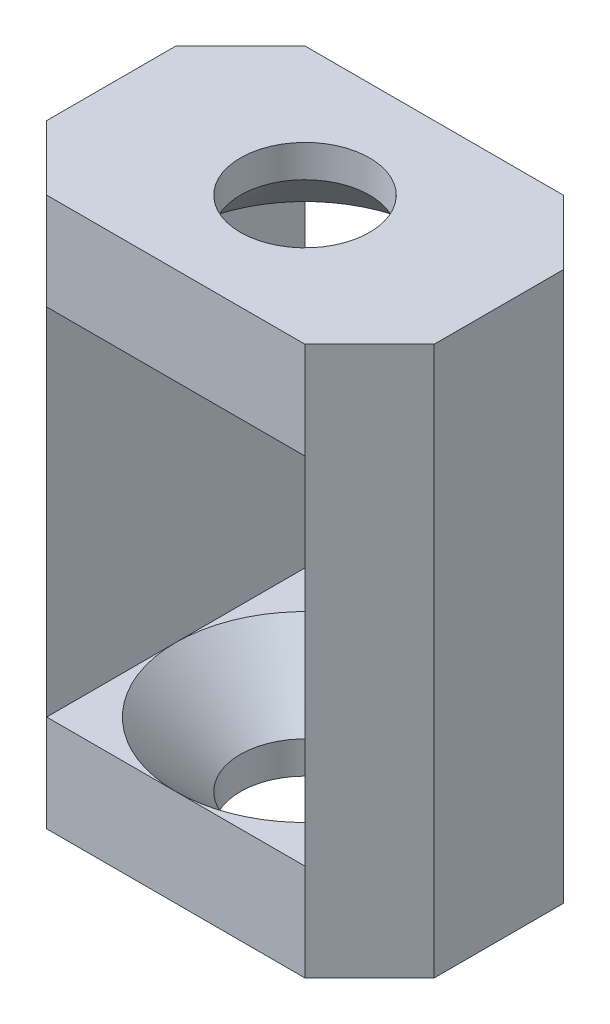
ISO-10303-21;
HEADER;
FILE_DESCRIPTION(('STEP AP214'),'2;1');
FILE_NAME('part.step','',(''),(''),'','','');
FILE_SCHEMA(('AUTOMOTIVE_DESIGN { 1 0 10303 214 1 1 1 1 }'));
ENDSEC;
DATA;
#1=APPLICATION_CONTEXT('core data for automotive mechanical design processes');
#2=APPLICATION_PROTOCOL_DEFINITION('international standard','automotive_design',2000,#1);
#3=PRODUCT_CONTEXT('',#1,'mechanical');
#4=PRODUCT('Part','Part','',(#3));
#5=PRODUCT_RELATED_PRODUCT_CATEGORY('part','',(#4));
#6=PRODUCT_DEFINITION_FORMATION('','',#4);
#7=PRODUCT_DEFINITION_CONTEXT('part definition',#1,'design');
#8=PRODUCT_DEFINITION('design','',#6,#7);
#9=PRODUCT_DEFINITION_SHAPE('','',#8);
#10=(LENGTH_UNIT() NAMED_UNIT(*) SI_UNIT(.MILLI.,.METRE.));
#11=(NAMED_UNIT(*) PLANE_ANGLE_UNIT() SI_UNIT($,.RADIAN.));
#12=(NAMED_UNIT(*) SI_UNIT($,.STERADIAN.) SOLID_ANGLE_UNIT());
#13=UNCERTAINTY_MEASURE_WITH_UNIT(LENGTH_MEASURE(1.E-05),#10,'distance_accuracy_value','');
#14=(GEOMETRIC_REPRESENTATION_CONTEXT(3) GLOBAL_UNCERTAINTY_ASSIGNED_CONTEXT((#13)) GLOBAL_UNIT_ASSIGNED_CONTEXT((#10,
#11,#12)) REPRESENTATION_CONTEXT('',''));
#15=CARTESIAN_POINT('',(0.,0.,0.));
#16=DIRECTION('',(0.,0.,1.));
#17=DIRECTION('',(1.,0.,0.));
#18=AXIS2_PLACEMENT_3D('',#15,#16,#17);
#19=CARTESIAN_POINT('',(-4.00000000000001,3.,-80.5));
#20=DIRECTION('',(0.,-1.,0.));
#21=DIRECTION('',(1.,0.,0.));
#22=AXIS2_PLACEMENT_3D('',#19,#20,#21);
#23=PLANE('',#22);
#24=DIRECTION('',(0.,0.,1.));
#25=VECTOR('',#24,1.);
#26=CARTESIAN_POINT('',(4.,3.,-80.5));
#27=LINE('',#26,#25);
#28=CARTESIAN_POINT('',(4.,3.,0.));
#29=VERTEX_POINT('',#28);
#30=CARTESIAN_POINT('',(3.99999999999999,3.,4.));
#31=VERTEX_POINT('',#30);
#32=EDGE_CURVE('E192',#29,#31,#27,.T.);
#33=ORIENTED_EDGE('',*,*,#32,.F.);
#34=CARTESIAN_POINT('',(0.,3.,0.));
#35=DIRECTION('',(0.,-1.,0.));
#36=DIRECTION('',(1.,0.,0.));
#37=AXIS2_PLACEMENT_3D('',#34,#35,#36);
#38=CIRCLE('',#37,3.99999999999999);
#39=CARTESIAN_POINT('',(0.,3.,4.));
#40=VERTEX_POINT('',#39);
#41=EDGE_CURVE('E60',#29,#40,#38,.T.);
#42=ORIENTED_EDGE('',*,*,#41,.T.);
#43=DIRECTION('',(-1.,0.,0.));
#44=VECTOR('',#43,1.);
#45=CARTESIAN_POINT('',(-6.00000000000001,3.,4.));
#46=LINE('',#45,#44);
#47=EDGE_CURVE('E252',#31,#40,#46,.T.);
#48=ORIENTED_EDGE('',*,*,#47,.F.);
#49=EDGE_LOOP('',(#33,#42,#48));
#50=FACE_BOUND('',#49,.T.);
#51=ADVANCED_FACE('F50',(#50),#23,.F.);
#52=CARTESIAN_POINT('',(-4.00000000000001,3.,3.99999999999998));
#53=VERTEX_POINT('',#52);
#54=EDGE_CURVE('E253',#40,#53,#46,.T.);
#55=ORIENTED_EDGE('',*,*,#54,.F.);
#56=CARTESIAN_POINT('',(0.,3.,0.));
#57=DIRECTION('',(0.,-1.,0.));
#58=DIRECTION('',(1.,0.,0.));
#59=AXIS2_PLACEMENT_3D('',#56,#57,#58);
#60=CIRCLE('',#59,3.99999999999999);
#61=CARTESIAN_POINT('',(-4.,3.,0.));
#62=VERTEX_POINT('',#61);
#63=EDGE_CURVE('E376',#40,#62,#60,.T.);
#64=ORIENTED_EDGE('',*,*,#63,.T.);
#65=DIRECTION('',(0.,0.,1.));
#66=VECTOR('',#65,1.);
#67=CARTESIAN_POINT('',(-4.00000000000001,3.,-80.5));
#68=LINE('',#67,#66);
#69=EDGE_CURVE('E373',#62,#53,#68,.T.);
#70=ORIENTED_EDGE('',*,*,#69,.T.);
#71=EDGE_LOOP('',(#55,#64,#70));
#72=FACE_BOUND('',#71,.T.);
#73=ADVANCED_FACE('F342',(#72),#23,.F.);
#74=CARTESIAN_POINT('',(-4.00000000000001,3.,-4.00000000000002));
#75=VERTEX_POINT('',#74);
#76=EDGE_CURVE('E370',#75,#62,#68,.T.);
#77=ORIENTED_EDGE('',*,*,#76,.T.);
#78=CARTESIAN_POINT('',(0.,3.,0.));
#79=DIRECTION('',(0.,-1.,0.));
#80=DIRECTION('',(1.,0.,0.));
#81=AXIS2_PLACEMENT_3D('',#78,#79,#80);
#82=CIRCLE('',#81,3.99999999999999);
#83=CARTESIAN_POINT('',(0.,3.,-4.));
#84=VERTEX_POINT('',#83);
#85=EDGE_CURVE('E63',#62,#84,#82,.T.);
#86=ORIENTED_EDGE('',*,*,#85,.T.);
#87=DIRECTION('',(1.,0.,0.));
#88=VECTOR('',#87,1.);
#89=CARTESIAN_POINT('',(-6.00000000000001,3.,-4.));
#90=LINE('',#89,#88);
#91=EDGE_CURVE('E171',#75,#84,#90,.T.);
#92=ORIENTED_EDGE('',*,*,#91,.F.);
#93=EDGE_LOOP('',(#77,#86,#92));
#94=FACE_BOUND('',#93,.T.);
#95=ADVANCED_FACE('F348',(#94),#23,.F.);
#96=CARTESIAN_POINT('',(-4.00000000000001,14.,-80.5));
#97=DIRECTION('',(0.,1.,0.));
#98=DIRECTION('',(0.,0.,1.));
#99=AXIS2_PLACEMENT_3D('',#96,#97,#98);
#100=PLANE('',#99);
#101=DIRECTION('',(1.,0.,0.));
#102=VECTOR('',#101,1.);
#103=CARTESIAN_POINT('',(-6.00000000000001,14.,4.));
#104=LINE('',#103,#102);
#105=CARTESIAN_POINT('',(0.,14.,4.));
#106=VERTEX_POINT('',#105);
#107=CARTESIAN_POINT('',(4.00000000000001,14.,3.99999999999996));
#108=VERTEX_POINT('',#107);
#109=EDGE_CURVE('E246',#106,#108,#104,.T.);
#110=ORIENTED_EDGE('',*,*,#109,.F.);
#111=CARTESIAN_POINT('',(0.,14.,0.));
#112=DIRECTION('',(0.,1.,0.));
#113=DIRECTION('',(0.,0.,1.));
#114=AXIS2_PLACEMENT_3D('',#111,#112,#113);
#115=CIRCLE('',#114,4.00000000000001);
#116=CARTESIAN_POINT('',(4.00000000000001,14.,0.));
#117=VERTEX_POINT('',#116);
#118=EDGE_CURVE('E461',#106,#117,#115,.T.);
#119=ORIENTED_EDGE('',*,*,#118,.T.);
#120=DIRECTION('',(0.,0.,1.));
#121=VECTOR('',#120,1.);
#122=CARTESIAN_POINT('',(4.00000000000001,14.,-80.5));
#123=LINE('',#122,#121);
#124=EDGE_CURVE('E476',#117,#108,#123,.T.);
#125=ORIENTED_EDGE('',*,*,#124,.T.);
#126=EDGE_LOOP('',(#110,#119,#125));
#127=FACE_BOUND('',#126,.T.);
#128=ADVANCED_FACE('F357',(#127),#100,.F.);
#129=CARTESIAN_POINT('',(4.,14.,-4.));
#130=VERTEX_POINT('',#129);
#131=EDGE_CURVE('E184',#130,#117,#123,.T.);
#132=ORIENTED_EDGE('',*,*,#131,.T.);
#133=CARTESIAN_POINT('',(0.,14.,0.));
#134=DIRECTION('',(0.,1.,0.));
#135=DIRECTION('',(0.,0.,1.));
#136=AXIS2_PLACEMENT_3D('',#133,#134,#135);
#137=CIRCLE('',#136,4.00000000000001);
#138=CARTESIAN_POINT('',(0.,14.,-4.));
#139=VERTEX_POINT('',#138);
#140=EDGE_CURVE('E462',#117,#139,#137,.T.);
#141=ORIENTED_EDGE('',*,*,#140,.T.);
#142=DIRECTION('',(-1.,0.,0.));
#143=VECTOR('',#142,1.);
#144=CARTESIAN_POINT('',(-6.00000000000001,14.,-4.));
#145=LINE('',#144,#143);
#146=EDGE_CURVE('E172',#130,#139,#145,.T.);
#147=ORIENTED_EDGE('',*,*,#146,.F.);
#148=EDGE_LOOP('',(#132,#141,#147));
#149=FACE_BOUND('',#148,.T.);
#150=ADVANCED_FACE('F365',(#149),#100,.F.);
#151=CARTESIAN_POINT('',(-4.00000000000001,14.,-4.00000000000002));
#152=VERTEX_POINT('',#151);
#153=EDGE_CURVE('E495',#139,#152,#145,.T.);
#154=ORIENTED_EDGE('',*,*,#153,.F.);
#155=CARTESIAN_POINT('',(0.,14.,0.));
#156=DIRECTION('',(0.,1.,0.));
#157=DIRECTION('',(0.,0.,1.));
#158=AXIS2_PLACEMENT_3D('',#155,#156,#157);
#159=CIRCLE('',#158,4.00000000000001);
#160=CARTESIAN_POINT('',(-4.00000000000001,14.,0.));
#161=VERTEX_POINT('',#160);
#162=EDGE_CURVE('E467',#139,#161,#159,.T.);
#163=ORIENTED_EDGE('',*,*,#162,.T.);
#164=DIRECTION('',(0.,0.,1.));
#165=VECTOR('',#164,1.);
#166=CARTESIAN_POINT('',(-4.00000000000001,14.,-80.5));
#167=LINE('',#166,#165);
#168=EDGE_CURVE('E483',#152,#161,#167,.T.);
#169=ORIENTED_EDGE('',*,*,#168,.F.);
#170=EDGE_LOOP('',(#154,#163,#169));
#171=FACE_BOUND('',#170,.T.);
#172=ADVANCED_FACE('F280',(#171),#100,.F.);
#173=CARTESIAN_POINT('',(0.,17.,0.));
#174=DIRECTION('',(0.,-1.,0.));
#175=DIRECTION('',(0.,0.,-1.));
#176=AXIS2_PLACEMENT_3D('',#173,#174,#175);
#177=PLANE('',#176);
#178=DIRECTION('',(-1.,0.,0.));
#179=VECTOR('',#178,1.);
#180=CARTESIAN_POINT('',(-6.00000000000001,17.,-4.));
#181=LINE('',#180,#179);
#182=CARTESIAN_POINT('',(4.,17.,-4.));
#183=VERTEX_POINT('',#182);
#184=CARTESIAN_POINT('',(-4.,17.,-4.));
#185=VERTEX_POINT('',#184);
#186=EDGE_CURVE('E499',#183,#185,#181,.T.);
#187=ORIENTED_EDGE('',*,*,#186,.T.);
#188=DIRECTION('',(0.707106781186548,0.,-0.707106781186547));
#189=VECTOR('',#188,1.);
#190=CARTESIAN_POINT('',(-6.00000000000001,17.,-1.99999999999999));
#191=LINE('',#190,#189);
#192=CARTESIAN_POINT('',(-6.00000000000001,17.,-1.99999999999999));
#193=VERTEX_POINT('',#192);
#194=EDGE_CURVE('E221',#185,#193,#191,.F.);
#195=ORIENTED_EDGE('',*,*,#194,.T.);
#196=DIRECTION('',(0.,0.,1.));
#197=VECTOR('',#196,1.);
#198=CARTESIAN_POINT('',(-6.00000000000001,17.,4.));
#199=LINE('',#198,#197);
#200=CARTESIAN_POINT('',(-6.00000000000001,17.,1.99999999999999));
#201=VERTEX_POINT('',#200);
#202=EDGE_CURVE('E416',#193,#201,#199,.T.);
#203=ORIENTED_EDGE('',*,*,#202,.T.);
#204=DIRECTION('',(-0.707106781186547,0.,-0.707106781186548));
#205=VECTOR('',#204,1.);
#206=CARTESIAN_POINT('',(-4.00000000000001,17.,4.));
#207=LINE('',#206,#205);
#208=CARTESIAN_POINT('',(-4.00000000000001,17.,4.));
#209=VERTEX_POINT('',#208);
#210=EDGE_CURVE('E222',#201,#209,#207,.F.);
#211=ORIENTED_EDGE('',*,*,#210,.T.);
#212=DIRECTION('',(1.,0.,0.));
#213=VECTOR('',#212,1.);
#214=CARTESIAN_POINT('',(-6.00000000000001,17.,4.));
#215=LINE('',#214,#213);
#216=CARTESIAN_POINT('',(3.99999999999999,17.,4.));
#217=VERTEX_POINT('',#216);
#218=EDGE_CURVE('E410',#209,#217,#215,.T.);
#219=ORIENTED_EDGE('',*,*,#218,.T.);
#220=DIRECTION('',(-0.707106781186549,0.,0.707106781186546));
#221=VECTOR('',#220,1.);
#222=CARTESIAN_POINT('',(5.99999999999999,17.,2.00000000000001));
#223=LINE('',#222,#221);
#224=CARTESIAN_POINT('',(5.99999999999999,17.,2.00000000000001));
#225=VERTEX_POINT('',#224);
#226=EDGE_CURVE('E214',#217,#225,#223,.F.);
#227=ORIENTED_EDGE('',*,*,#226,.T.);
#228=DIRECTION('',(0.,0.,-1.));
#229=VECTOR('',#228,1.);
#230=CARTESIAN_POINT('',(5.99999999999999,17.,4.));
#231=LINE('',#230,#229);
#232=CARTESIAN_POINT('',(5.99999999999999,17.,-2.));
#233=VERTEX_POINT('',#232);
#234=EDGE_CURVE('E421',#225,#233,#231,.T.);
#235=ORIENTED_EDGE('',*,*,#234,.T.);
#236=DIRECTION('',(0.707106781186547,0.,0.707106781186548));
#237=VECTOR('',#236,1.);
#238=CARTESIAN_POINT('',(4.,17.,-4.));
#239=LINE('',#238,#237);
#240=EDGE_CURVE('E217',#233,#183,#239,.F.);
#241=ORIENTED_EDGE('',*,*,#240,.T.);
#242=EDGE_LOOP('',(#187,#195,#203,#211,#219,#227,#235,#241));
#243=FACE_BOUND('',#242,.T.);
#244=CARTESIAN_POINT('',(0.,17.000012,0.));
#245=DIRECTION('',(0.,1.,0.));
#246=DIRECTION('',(0.,0.,1.));
#247=AXIS2_PLACEMENT_3D('',#244,#245,#246);
#248=CIRCLE('',#247,2.);
#249=CARTESIAN_POINT('',(0.,17.000012,2.));
#250=VERTEX_POINT('',#249);
#251=EDGE_CURVE('E261',#250,#250,#248,.T.);
#252=ORIENTED_EDGE('',*,*,#251,.F.);
#253=EDGE_LOOP('',(#252));
#254=FACE_BOUND('',#253,.T.);
#255=ADVANCED_FACE('F270',(#243,#254),#177,.F.);
#256=CARTESIAN_POINT('',(-6.00000000000001,17.,-4.));
#257=DIRECTION('',(0.,0.,1.));
#258=DIRECTION('',(1.,0.,0.));
#259=AXIS2_PLACEMENT_3D('',#256,#257,#258);
#260=PLANE('',#259);
#261=DIRECTION('',(0.,1.,0.));
#262=VECTOR('',#261,1.);
#263=CARTESIAN_POINT('',(-4.,17.,-4.));
#264=LINE('',#263,#262);
#265=CARTESIAN_POINT('',(-4.,0.,-4.));
#266=VERTEX_POINT('',#265);
#267=EDGE_CURVE('E215',#266,#75,#264,.T.);
#268=ORIENTED_EDGE('',*,*,#267,.T.);
#269=ORIENTED_EDGE('',*,*,#91,.T.);
#270=CARTESIAN_POINT('',(4.,3.,-4.00000000000002));
#271=VERTEX_POINT('',#270);
#272=EDGE_CURVE('E162',#84,#271,#90,.T.);
#273=ORIENTED_EDGE('',*,*,#272,.T.);
#274=DIRECTION('',(0.,-1.,0.));
#275=VECTOR('',#274,1.);
#276=CARTESIAN_POINT('',(4.,17.,-4.));
#277=LINE('',#276,#275);
#278=CARTESIAN_POINT('',(4.,0.,-4.));
#279=VERTEX_POINT('',#278);
#280=EDGE_CURVE('E166',#271,#279,#277,.T.);
#281=ORIENTED_EDGE('',*,*,#280,.T.);
#282=DIRECTION('',(-1.,0.,0.));
#283=VECTOR('',#282,1.);
#284=CARTESIAN_POINT('',(-6.00000000000001,0.,-4.));
#285=LINE('',#284,#283);
#286=EDGE_CURVE('E430',#279,#266,#285,.T.);
#287=ORIENTED_EDGE('',*,*,#286,.T.);
#288=EDGE_LOOP('',(#268,#269,#273,#281,#287));
#289=FACE_BOUND('',#288,.T.);
#290=ADVANCED_FACE('F167',(#289),#260,.F.);
#291=CARTESIAN_POINT('',(-6.00000000000001,17.,4.));
#292=DIRECTION('',(0.,0.,-1.));
#293=DIRECTION('',(-1.,0.,0.));
#294=AXIS2_PLACEMENT_3D('',#291,#292,#293);
#295=PLANE('',#294);
#296=DIRECTION('',(0.,1.,0.));
#297=VECTOR('',#296,1.);
#298=CARTESIAN_POINT('',(3.99999999999999,17.,4.));
#299=LINE('',#298,#297);
#300=CARTESIAN_POINT('',(3.99999999999999,0.,4.));
#301=VERTEX_POINT('',#300);
#302=EDGE_CURVE('E227',#301,#31,#299,.T.);
#303=ORIENTED_EDGE('',*,*,#302,.T.);
#304=ORIENTED_EDGE('',*,*,#47,.T.);
#305=ORIENTED_EDGE('',*,*,#54,.T.);
#306=DIRECTION('',(0.,-1.,0.));
#307=VECTOR('',#306,1.);
#308=CARTESIAN_POINT('',(-4.00000000000001,17.,4.));
#309=LINE('',#308,#307);
#310=CARTESIAN_POINT('',(-4.00000000000001,0.,4.));
#311=VERTEX_POINT('',#310);
#312=EDGE_CURVE('E235',#53,#311,#309,.T.);
#313=ORIENTED_EDGE('',*,*,#312,.T.);
#314=DIRECTION('',(1.,0.,0.));
#315=VECTOR('',#314,1.);
#316=CARTESIAN_POINT('',(-6.00000000000001,0.,4.));
#317=LINE('',#316,#315);
#318=EDGE_CURVE('E400',#311,#301,#317,.T.);
#319=ORIENTED_EDGE('',*,*,#318,.T.);
#320=EDGE_LOOP('',(#303,#304,#305,#313,#319));
#321=FACE_BOUND('',#320,.T.);
#322=ADVANCED_FACE('F289',(#321),#295,.F.);
#323=CARTESIAN_POINT('',(5.99999999999999,17.,4.));
#324=DIRECTION('',(-1.,0.,0.));
#325=DIRECTION('',(0.,0.,1.));
#326=AXIS2_PLACEMENT_3D('',#323,#324,#325);
#327=PLANE('',#326);
#328=DIRECTION('',(0.,0.,-1.));
#329=VECTOR('',#328,1.);
#330=CARTESIAN_POINT('',(5.99999999999999,0.,4.));
#331=LINE('',#330,#329);
#332=CARTESIAN_POINT('',(5.99999999999999,0.,2.00000000000001));
#333=VERTEX_POINT('',#332);
#334=CARTESIAN_POINT('',(5.99999999999999,0.,-2.));
#335=VERTEX_POINT('',#334);
#336=EDGE_CURVE('E425',#333,#335,#331,.T.);
#337=ORIENTED_EDGE('',*,*,#336,.T.);
#338=DIRECTION('',(0.,1.,0.));
#339=VECTOR('',#338,1.);
#340=CARTESIAN_POINT('',(5.99999999999999,17.,-2.));
#341=LINE('',#340,#339);
#342=EDGE_CURVE('E242',#335,#233,#341,.T.);
#343=ORIENTED_EDGE('',*,*,#342,.T.);
#344=ORIENTED_EDGE('',*,*,#234,.F.);
#345=DIRECTION('',(0.,-1.,0.));
#346=VECTOR('',#345,1.);
#347=CARTESIAN_POINT('',(5.99999999999999,17.,2.00000000000001));
#348=LINE('',#347,#346);
#349=EDGE_CURVE('E236',#225,#333,#348,.T.);
#350=ORIENTED_EDGE('',*,*,#349,.T.);
#351=EDGE_LOOP('',(#337,#343,#344,#350));
#352=FACE_BOUND('',#351,.T.);
#353=ADVANCED_FACE('F300',(#352),#327,.F.);
#354=EDGE_CURVE('E205',#183,#130,#277,.T.);
#355=ORIENTED_EDGE('',*,*,#354,.T.);
#356=ORIENTED_EDGE('',*,*,#146,.T.);
#357=ORIENTED_EDGE('',*,*,#153,.T.);
#358=EDGE_CURVE('E210',#152,#185,#264,.T.);
#359=ORIENTED_EDGE('',*,*,#358,.T.);
#360=ORIENTED_EDGE('',*,*,#186,.F.);
#361=EDGE_LOOP('',(#355,#356,#357,#359,#360));
#362=FACE_BOUND('',#361,.T.);
#363=ADVANCED_FACE('F291',(#362),#260,.F.);
#364=CARTESIAN_POINT('',(-6.00000000000001,17.,4.));
#365=DIRECTION('',(1.,0.,0.));
#366=DIRECTION('',(0.,0.,-1.));
#367=AXIS2_PLACEMENT_3D('',#364,#365,#366);
#368=PLANE('',#367);
#369=ORIENTED_EDGE('',*,*,#202,.F.);
#370=DIRECTION('',(0.,-1.,0.));
#371=VECTOR('',#370,1.);
#372=CARTESIAN_POINT('',(-6.00000000000001,17.,-1.99999999999999));
#373=LINE('',#372,#371);
#374=CARTESIAN_POINT('',(-6.00000000000001,0.,-1.99999999999999));
#375=VERTEX_POINT('',#374);
#376=EDGE_CURVE('E445',#193,#375,#373,.T.);
#377=ORIENTED_EDGE('',*,*,#376,.T.);
#378=DIRECTION('',(0.,0.,1.));
#379=VECTOR('',#378,1.);
#380=CARTESIAN_POINT('',(-6.00000000000001,0.,4.));
#381=LINE('',#380,#379);
#382=CARTESIAN_POINT('',(-6.00000000000001,0.,1.99999999999999));
#383=VERTEX_POINT('',#382);
#384=EDGE_CURVE('E431',#375,#383,#381,.T.);
#385=ORIENTED_EDGE('',*,*,#384,.T.);
#386=DIRECTION('',(0.,1.,0.));
#387=VECTOR('',#386,1.);
#388=CARTESIAN_POINT('',(-6.00000000000001,17.,1.99999999999999));
#389=LINE('',#388,#387);
#390=EDGE_CURVE('E417',#383,#201,#389,.T.);
#391=ORIENTED_EDGE('',*,*,#390,.T.);
#392=EDGE_LOOP('',(#369,#377,#385,#391));
#393=FACE_BOUND('',#392,.T.);
#394=ADVANCED_FACE('F288',(#393),#368,.F.);
#395=CARTESIAN_POINT('',(-4.00000000000001,14.,3.99999999999998));
#396=VERTEX_POINT('',#395);
#397=EDGE_CURVE('E232',#209,#396,#309,.T.);
#398=ORIENTED_EDGE('',*,*,#397,.T.);
#399=EDGE_CURVE('E250',#396,#106,#104,.T.);
#400=ORIENTED_EDGE('',*,*,#399,.T.);
#401=ORIENTED_EDGE('',*,*,#109,.T.);
#402=EDGE_CURVE('E230',#108,#217,#299,.T.);
#403=ORIENTED_EDGE('',*,*,#402,.T.);
#404=ORIENTED_EDGE('',*,*,#218,.F.);
#405=EDGE_LOOP('',(#398,#400,#401,#403,#404));
#406=FACE_BOUND('',#405,.T.);
#407=ADVANCED_FACE('F283',(#406),#295,.F.);
#408=CARTESIAN_POINT('',(0.,0.,0.));
#409=DIRECTION('',(0.,-1.,0.));
#410=DIRECTION('',(0.,0.,-1.));
#411=AXIS2_PLACEMENT_3D('',#408,#409,#410);
#412=PLANE('',#411);
#413=CARTESIAN_POINT('',(0.,0.,0.));
#414=DIRECTION('',(0.,1.,0.));
#415=DIRECTION('',(0.,0.,1.));
#416=AXIS2_PLACEMENT_3D('',#413,#414,#415);
#417=CIRCLE('',#416,2.);
#418=CARTESIAN_POINT('',(0.,0.,2.));
#419=VERTEX_POINT('',#418);
#420=EDGE_CURVE('E674',#419,#419,#417,.T.);
#421=ORIENTED_EDGE('',*,*,#420,.T.);
#422=EDGE_LOOP('',(#421));
#423=FACE_BOUND('',#422,.T.);
#424=ORIENTED_EDGE('',*,*,#384,.F.);
#425=DIRECTION('',(-0.707106781186548,0.,0.707106781186547));
#426=VECTOR('',#425,1.);
#427=CARTESIAN_POINT('',(-4.,0.,-4.));
#428=LINE('',#427,#426);
#429=EDGE_CURVE('E201',#375,#266,#428,.F.);
#430=ORIENTED_EDGE('',*,*,#429,.T.);
#431=ORIENTED_EDGE('',*,*,#286,.F.);
#432=DIRECTION('',(-0.707106781186547,0.,-0.707106781186548));
#433=VECTOR('',#432,1.);
#434=CARTESIAN_POINT('',(4.,0.,-4.));
#435=LINE('',#434,#433);
#436=EDGE_CURVE('E200',#279,#335,#435,.F.);
#437=ORIENTED_EDGE('',*,*,#436,.T.);
#438=ORIENTED_EDGE('',*,*,#336,.F.);
#439=DIRECTION('',(0.707106781186549,0.,-0.707106781186546));
#440=VECTOR('',#439,1.);
#441=CARTESIAN_POINT('',(3.99999999999999,0.,4.));
#442=LINE('',#441,#440);
#443=EDGE_CURVE('E399',#333,#301,#442,.F.);
#444=ORIENTED_EDGE('',*,*,#443,.T.);
#445=ORIENTED_EDGE('',*,*,#318,.F.);
#446=DIRECTION('',(0.707106781186547,0.,0.707106781186548));
#447=VECTOR('',#446,1.);
#448=CARTESIAN_POINT('',(-4.00000000000001,0.,4.));
#449=LINE('',#448,#447);
#450=EDGE_CURVE('E208',#311,#383,#449,.F.);
#451=ORIENTED_EDGE('',*,*,#450,.T.);
#452=EDGE_LOOP('',(#424,#430,#431,#437,#438,#444,#445,#451));
#453=FACE_BOUND('',#452,.T.);
#454=ADVANCED_FACE('F278',(#423,#453),#412,.T.);
#455=CARTESIAN_POINT('',(-6.00000000000001,17.,-1.99999999999999));
#456=DIRECTION('',(0.707106781186547,0.,0.707106781186548));
#457=DIRECTION('',(0.,-1.,0.));
#458=AXIS2_PLACEMENT_3D('',#455,#456,#457);
#459=PLANE('',#458);
#460=ORIENTED_EDGE('',*,*,#194,.F.);
#461=ORIENTED_EDGE('',*,*,#358,.F.);
#462=DIRECTION('',(0.,-1.,0.));
#463=VECTOR('',#462,1.);
#464=CARTESIAN_POINT('',(-4.00000000000001,17.,-3.99999999999999));
#465=LINE('',#464,#463);
#466=EDGE_CURVE('E189',#75,#152,#465,.F.);
#467=ORIENTED_EDGE('',*,*,#466,.F.);
#468=ORIENTED_EDGE('',*,*,#267,.F.);
#469=ORIENTED_EDGE('',*,*,#429,.F.);
#470=ORIENTED_EDGE('',*,*,#376,.F.);
#471=EDGE_LOOP('',(#460,#461,#467,#468,#469,#470));
#472=FACE_BOUND('',#471,.T.);
#473=ADVANCED_FACE('F282',(#472),#459,.F.);
#474=CARTESIAN_POINT('',(-4.00000000000001,17.,4.));
#475=DIRECTION('',(0.707106781186548,0.,-0.707106781186547));
#476=DIRECTION('',(0.,-1.,0.));
#477=AXIS2_PLACEMENT_3D('',#474,#475,#476);
#478=PLANE('',#477);
#479=ORIENTED_EDGE('',*,*,#210,.F.);
#480=ORIENTED_EDGE('',*,*,#390,.F.);
#481=ORIENTED_EDGE('',*,*,#450,.F.);
#482=ORIENTED_EDGE('',*,*,#312,.F.);
#483=EDGE_CURVE('E239',#396,#53,#309,.T.);
#484=ORIENTED_EDGE('',*,*,#483,.F.);
#485=ORIENTED_EDGE('',*,*,#397,.F.);
#486=EDGE_LOOP('',(#479,#480,#481,#482,#484,#485));
#487=FACE_BOUND('',#486,.T.);
#488=ADVANCED_FACE('F306',(#487),#478,.F.);
#489=CARTESIAN_POINT('',(4.,17.,-4.));
#490=DIRECTION('',(-0.707106781186548,0.,0.707106781186547));
#491=DIRECTION('',(0.,-1.,0.));
#492=AXIS2_PLACEMENT_3D('',#489,#490,#491);
#493=PLANE('',#492);
#494=ORIENTED_EDGE('',*,*,#240,.F.);
#495=ORIENTED_EDGE('',*,*,#342,.F.);
#496=ORIENTED_EDGE('',*,*,#436,.F.);
#497=ORIENTED_EDGE('',*,*,#280,.F.);
#498=DIRECTION('',(0.,1.,0.));
#499=VECTOR('',#498,1.);
#500=CARTESIAN_POINT('',(4.00000000000001,17.,-3.99999999999999));
#501=LINE('',#500,#499);
#502=EDGE_CURVE('E178',#130,#271,#501,.F.);
#503=ORIENTED_EDGE('',*,*,#502,.F.);
#504=ORIENTED_EDGE('',*,*,#354,.F.);
#505=EDGE_LOOP('',(#494,#495,#496,#497,#503,#504));
#506=FACE_BOUND('',#505,.T.);
#507=ADVANCED_FACE('F197',(#506),#493,.F.);
#508=CARTESIAN_POINT('',(5.99999999999999,17.,2.00000000000001));
#509=DIRECTION('',(-0.707106781186546,0.,-0.707106781186549));
#510=DIRECTION('',(0.,-1.,0.));
#511=AXIS2_PLACEMENT_3D('',#508,#509,#510);
#512=PLANE('',#511);
#513=ORIENTED_EDGE('',*,*,#226,.F.);
#514=ORIENTED_EDGE('',*,*,#402,.F.);
#515=EDGE_CURVE('E233',#31,#108,#299,.T.);
#516=ORIENTED_EDGE('',*,*,#515,.F.);
#517=ORIENTED_EDGE('',*,*,#302,.F.);
#518=ORIENTED_EDGE('',*,*,#443,.F.);
#519=ORIENTED_EDGE('',*,*,#349,.F.);
#520=EDGE_LOOP('',(#513,#514,#516,#517,#518,#519));
#521=FACE_BOUND('',#520,.T.);
#522=ADVANCED_FACE('F321',(#521),#512,.F.);
#523=ORIENTED_EDGE('',*,*,#272,.F.);
#524=CARTESIAN_POINT('',(0.,3.,0.));
#525=DIRECTION('',(0.,-1.,0.));
#526=DIRECTION('',(1.,0.,0.));
#527=AXIS2_PLACEMENT_3D('',#524,#525,#526);
#528=CIRCLE('',#527,3.99999999999999);
#529=EDGE_CURVE('E72',#84,#29,#528,.T.);
#530=ORIENTED_EDGE('',*,*,#529,.T.);
#531=EDGE_CURVE('E179',#271,#29,#27,.T.);
#532=ORIENTED_EDGE('',*,*,#531,.F.);
#533=EDGE_LOOP('',(#523,#530,#532));
#534=FACE_BOUND('',#533,.T.);
#535=ADVANCED_FACE('F195',(#534),#23,.F.);
#536=EDGE_CURVE('E478',#161,#396,#167,.T.);
#537=ORIENTED_EDGE('',*,*,#536,.F.);
#538=CARTESIAN_POINT('',(0.,14.,0.));
#539=DIRECTION('',(0.,1.,0.));
#540=DIRECTION('',(0.,0.,1.));
#541=AXIS2_PLACEMENT_3D('',#538,#539,#540);
#542=CIRCLE('',#541,4.00000000000001);
#543=EDGE_CURVE('E258',#161,#106,#542,.T.);
#544=ORIENTED_EDGE('',*,*,#543,.T.);
#545=ORIENTED_EDGE('',*,*,#399,.F.);
#546=EDGE_LOOP('',(#537,#544,#545));
#547=FACE_BOUND('',#546,.T.);
#548=ADVANCED_FACE('F353',(#547),#100,.F.);
#549=CARTESIAN_POINT('',(4.00000000000001,14.,-80.5));
#550=DIRECTION('',(1.,0.,0.));
#551=DIRECTION('',(0.,1.,0.));
#552=AXIS2_PLACEMENT_3D('',#549,#550,#551);
#553=PLANE('',#552);
#554=ORIENTED_EDGE('',*,*,#502,.T.);
#555=ORIENTED_EDGE('',*,*,#531,.T.);
#556=ORIENTED_EDGE('',*,*,#32,.T.);
#557=ORIENTED_EDGE('',*,*,#515,.T.);
#558=ORIENTED_EDGE('',*,*,#124,.F.);
#559=ORIENTED_EDGE('',*,*,#131,.F.);
#560=EDGE_LOOP('',(#554,#555,#556,#557,#558,#559));
#561=FACE_BOUND('',#560,.T.);
#562=ADVANCED_FACE('F177',(#561),#553,.F.);
#563=CARTESIAN_POINT('',(-4.00000000000001,14.,-80.5));
#564=DIRECTION('',(-1.,0.,0.));
#565=DIRECTION('',(0.,-1.,0.));
#566=AXIS2_PLACEMENT_3D('',#563,#564,#565);
#567=PLANE('',#566);
#568=ORIENTED_EDGE('',*,*,#466,.T.);
#569=ORIENTED_EDGE('',*,*,#168,.T.);
#570=ORIENTED_EDGE('',*,*,#536,.T.);
#571=ORIENTED_EDGE('',*,*,#483,.T.);
#572=ORIENTED_EDGE('',*,*,#69,.F.);
#573=ORIENTED_EDGE('',*,*,#76,.F.);
#574=EDGE_LOOP('',(#568,#569,#570,#571,#572,#573));
#575=FACE_BOUND('',#574,.T.);
#576=ADVANCED_FACE('F485',(#575),#567,.F.);
#577=CARTESIAN_POINT('',(0.,0.,0.));
#578=DIRECTION('',(0.,1.,0.));
#579=DIRECTION('',(0.,0.,1.));
#580=AXIS2_PLACEMENT_3D('',#577,#578,#579);
#581=CYLINDRICAL_SURFACE('',#580,2.);
#582=CARTESIAN_POINT('',(0.,16.,0.));
#583=DIRECTION('',(0.,1.,0.));
#584=DIRECTION('',(0.,0.,1.));
#585=AXIS2_PLACEMENT_3D('',#582,#583,#584);
#586=CIRCLE('',#585,2.);
#587=CARTESIAN_POINT('',(0.,16.,2.));
#588=VERTEX_POINT('',#587);
#589=EDGE_CURVE('E382',#588,#588,#586,.F.);
#590=ORIENTED_EDGE('',*,*,#589,.T.);
#591=EDGE_LOOP('',(#590));
#592=FACE_BOUND('',#591,.T.);
#593=ORIENTED_EDGE('',*,*,#251,.T.);
#594=EDGE_LOOP('',(#593));
#595=FACE_BOUND('',#594,.T.);
#596=ADVANCED_FACE('F337',(#592,#595),#581,.F.);
#597=CARTESIAN_POINT('',(0.,1.,0.));
#598=DIRECTION('',(0.,-1.,0.));
#599=DIRECTION('',(0.,0.,-1.));
#600=AXIS2_PLACEMENT_3D('',#597,#598,#599);
#601=CIRCLE('',#600,2.);
#602=CARTESIAN_POINT('',(0.,1.,-2.));
#603=VERTEX_POINT('',#602);
#604=EDGE_CURVE('E11',#603,#603,#601,.F.);
#605=ORIENTED_EDGE('',*,*,#604,.T.);
#606=EDGE_LOOP('',(#605));
#607=FACE_BOUND('',#606,.T.);
#608=ORIENTED_EDGE('',*,*,#420,.F.);
#609=EDGE_LOOP('',(#608));
#610=FACE_BOUND('',#609,.T.);
#611=ADVANCED_FACE('F332',(#607,#610),#581,.F.);
#612=CARTESIAN_POINT('',(0.,14.,0.));
#613=DIRECTION('',(0.,-1.,0.));
#614=DIRECTION('',(0.,0.,-1.));
#615=AXIS2_PLACEMENT_3D('',#612,#613,#614);
#616=CONICAL_SURFACE('',#615,4.00000000000001,0.785398163397447);
#617=ORIENTED_EDGE('',*,*,#589,.F.);
#618=EDGE_LOOP('',(#617));
#619=FACE_BOUND('',#618,.T.);
#620=ORIENTED_EDGE('',*,*,#140,.F.);
#621=ORIENTED_EDGE('',*,*,#118,.F.);
#622=ORIENTED_EDGE('',*,*,#543,.F.);
#623=ORIENTED_EDGE('',*,*,#162,.F.);
#624=EDGE_LOOP('',(#620,#621,#622,#623));
#625=FACE_BOUND('',#624,.T.);
#626=ADVANCED_FACE('F330',(#619,#625),#616,.F.);
#627=CARTESIAN_POINT('',(0.,3.,0.));
#628=DIRECTION('',(0.,1.,0.));
#629=DIRECTION('',(0.,0.,1.));
#630=AXIS2_PLACEMENT_3D('',#627,#628,#629);
#631=CONICAL_SURFACE('',#630,3.99999999999999,0.785398163397447);
#632=ORIENTED_EDGE('',*,*,#604,.F.);
#633=EDGE_LOOP('',(#632));
#634=FACE_BOUND('',#633,.T.);
#635=ORIENTED_EDGE('',*,*,#63,.F.);
#636=ORIENTED_EDGE('',*,*,#41,.F.);
#637=ORIENTED_EDGE('',*,*,#529,.F.);
#638=ORIENTED_EDGE('',*,*,#85,.F.);
#639=EDGE_LOOP('',(#635,#636,#637,#638));
#640=FACE_BOUND('',#639,.T.);
#641=ADVANCED_FACE('F49',(#634,#640),#631,.F.);
#642=CLOSED_SHELL('',(#51,#73,#95,#128,#150,#172,#255,#290,#322,#353,#363,#394,#407,#454,#473,
#488,#507,#522,#535,#548,#562,#576,#596,#611,#626,#641));
#643=MANIFOLD_SOLID_BREP('B2',#642);
#644=ADVANCED_BREP_SHAPE_REPRESENTATION('',(#18,#643),#14);
#645=SHAPE_DEFINITION_REPRESENTATION(#9,#644);
ENDSEC;
END-ISO-10303-21;
